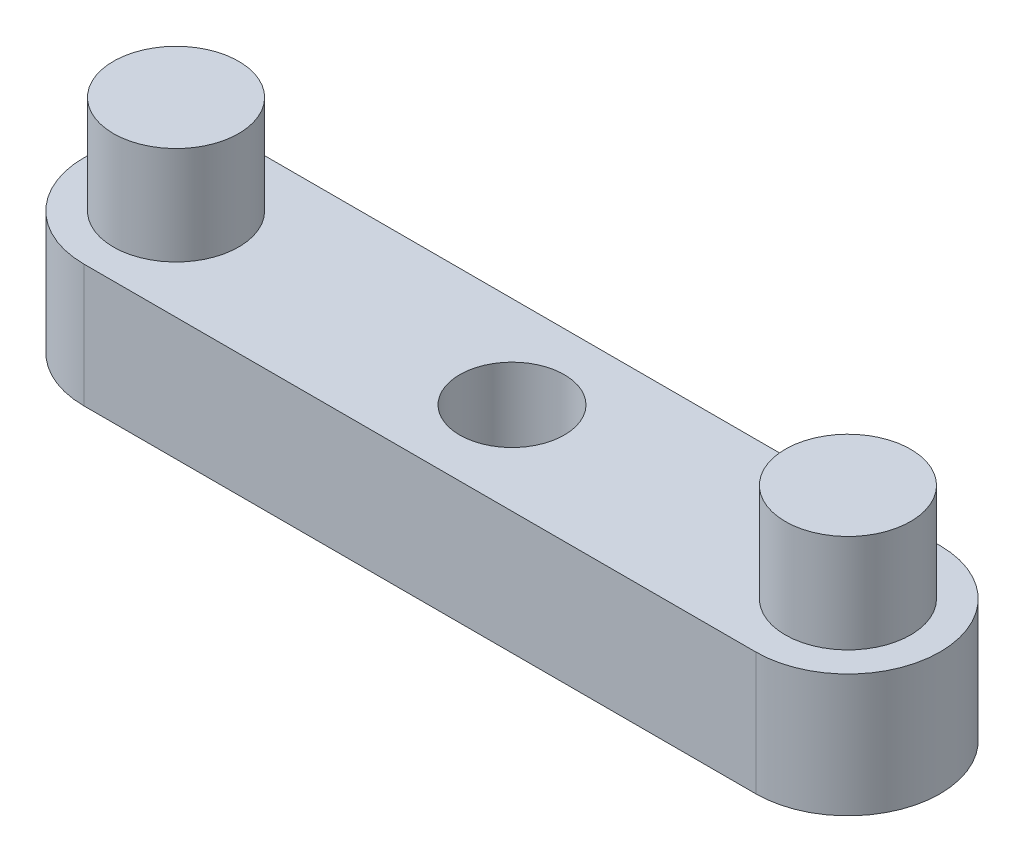
ISO-10303-21;
HEADER;
FILE_DESCRIPTION(('STEP AP214'),'2;1');
FILE_NAME('part.step','',(''),(''),'','','');
FILE_SCHEMA(('AUTOMOTIVE_DESIGN { 1 0 10303 214 1 1 1 1 }'));
ENDSEC;
DATA;
#1=APPLICATION_CONTEXT('core data for automotive mechanical design processes');
#2=APPLICATION_PROTOCOL_DEFINITION('international standard','automotive_design',2000,#1);
#3=PRODUCT_CONTEXT('',#1,'mechanical');
#4=PRODUCT('Part','Part','',(#3));
#5=PRODUCT_RELATED_PRODUCT_CATEGORY('part','',(#4));
#6=PRODUCT_DEFINITION_FORMATION('','',#4);
#7=PRODUCT_DEFINITION_CONTEXT('part definition',#1,'design');
#8=PRODUCT_DEFINITION('design','',#6,#7);
#9=PRODUCT_DEFINITION_SHAPE('','',#8);
#10=(LENGTH_UNIT() NAMED_UNIT(*) SI_UNIT(.MILLI.,.METRE.));
#11=(NAMED_UNIT(*) PLANE_ANGLE_UNIT() SI_UNIT($,.RADIAN.));
#12=(NAMED_UNIT(*) SI_UNIT($,.STERADIAN.) SOLID_ANGLE_UNIT());
#13=UNCERTAINTY_MEASURE_WITH_UNIT(LENGTH_MEASURE(1.E-05),#10,'distance_accuracy_value','');
#14=(GEOMETRIC_REPRESENTATION_CONTEXT(3) GLOBAL_UNCERTAINTY_ASSIGNED_CONTEXT((#13)) GLOBAL_UNIT_ASSIGNED_CONTEXT((#10,
#11,#12)) REPRESENTATION_CONTEXT('',''));
#15=CARTESIAN_POINT('',(0.,0.,0.));
#16=DIRECTION('',(0.,0.,1.));
#17=DIRECTION('',(1.,0.,0.));
#18=AXIS2_PLACEMENT_3D('',#15,#16,#17);
#19=CARTESIAN_POINT('',(-13.675,-2.5,0.));
#20=DIRECTION('',(0.,1.,0.));
#21=DIRECTION('',(0.,0.,1.));
#22=AXIS2_PLACEMENT_3D('',#19,#20,#21);
#23=CYLINDRICAL_SURFACE('',#22,3.75);
#24=DIRECTION('',(0.,1.,0.));
#25=VECTOR('',#24,1.);
#26=CARTESIAN_POINT('',(-13.675,-2.5,3.75));
#27=LINE('',#26,#25);
#28=CARTESIAN_POINT('',(-13.675,-2.5,3.75));
#29=VERTEX_POINT('',#28);
#30=CARTESIAN_POINT('',(-13.675,2.5,3.75));
#31=VERTEX_POINT('',#30);
#32=EDGE_CURVE('E48',#29,#31,#27,.T.);
#33=ORIENTED_EDGE('',*,*,#32,.T.);
#34=CARTESIAN_POINT('',(-13.675,2.5,0.));
#35=DIRECTION('',(0.,1.,0.));
#36=DIRECTION('',(0.,0.,1.));
#37=AXIS2_PLACEMENT_3D('',#34,#35,#36);
#38=CIRCLE('',#37,3.75);
#39=CARTESIAN_POINT('',(-13.675,2.5,-3.75));
#40=VERTEX_POINT('',#39);
#41=EDGE_CURVE('E86',#40,#31,#38,.T.);
#42=ORIENTED_EDGE('',*,*,#41,.F.);
#43=DIRECTION('',(0.,1.,0.));
#44=VECTOR('',#43,1.);
#45=CARTESIAN_POINT('',(-13.675,-2.5,-3.75));
#46=LINE('',#45,#44);
#47=CARTESIAN_POINT('',(-13.675,-2.5,-3.75));
#48=VERTEX_POINT('',#47);
#49=EDGE_CURVE('E11',#48,#40,#46,.T.);
#50=ORIENTED_EDGE('',*,*,#49,.F.);
#51=CARTESIAN_POINT('',(-13.675,-2.5,0.));
#52=DIRECTION('',(0.,1.,0.));
#53=DIRECTION('',(0.,0.,1.));
#54=AXIS2_PLACEMENT_3D('',#51,#52,#53);
#55=CIRCLE('',#54,3.75);
#56=EDGE_CURVE('E87',#48,#29,#55,.T.);
#57=ORIENTED_EDGE('',*,*,#56,.T.);
#58=EDGE_LOOP('',(#33,#42,#50,#57));
#59=FACE_BOUND('',#58,.T.);
#60=ADVANCED_FACE('F45',(#59),#23,.T.);
#61=CARTESIAN_POINT('',(-13.675,-2.5,-3.75));
#62=DIRECTION('',(0.,0.,-1.));
#63=DIRECTION('',(-1.,0.,0.));
#64=AXIS2_PLACEMENT_3D('',#61,#62,#63);
#65=PLANE('',#64);
#66=ORIENTED_EDGE('',*,*,#49,.T.);
#67=DIRECTION('',(-1.,0.,0.));
#68=VECTOR('',#67,1.);
#69=CARTESIAN_POINT('',(-13.675,2.5,-3.75));
#70=LINE('',#69,#68);
#71=CARTESIAN_POINT('',(13.675,2.5,-3.75));
#72=VERTEX_POINT('',#71);
#73=EDGE_CURVE('E106',#72,#40,#70,.T.);
#74=ORIENTED_EDGE('',*,*,#73,.F.);
#75=DIRECTION('',(0.,1.,0.));
#76=VECTOR('',#75,1.);
#77=CARTESIAN_POINT('',(13.675,-2.5,-3.75));
#78=LINE('',#77,#76);
#79=CARTESIAN_POINT('',(13.675,-2.5,-3.75));
#80=VERTEX_POINT('',#79);
#81=EDGE_CURVE('E54',#80,#72,#78,.T.);
#82=ORIENTED_EDGE('',*,*,#81,.F.);
#83=DIRECTION('',(-1.,0.,0.));
#84=VECTOR('',#83,1.);
#85=CARTESIAN_POINT('',(-13.675,-2.5,-3.75));
#86=LINE('',#85,#84);
#87=EDGE_CURVE('E93',#80,#48,#86,.T.);
#88=ORIENTED_EDGE('',*,*,#87,.T.);
#89=EDGE_LOOP('',(#66,#74,#82,#88));
#90=FACE_BOUND('',#89,.T.);
#91=ADVANCED_FACE('F140',(#90),#65,.T.);
#92=CARTESIAN_POINT('',(13.675,-2.5,0.));
#93=DIRECTION('',(0.,1.,0.));
#94=DIRECTION('',(0.,0.,1.));
#95=AXIS2_PLACEMENT_3D('',#92,#93,#94);
#96=CYLINDRICAL_SURFACE('',#95,3.75);
#97=ORIENTED_EDGE('',*,*,#81,.T.);
#98=CARTESIAN_POINT('',(13.675,2.5,0.));
#99=DIRECTION('',(0.,1.,0.));
#100=DIRECTION('',(0.,0.,1.));
#101=AXIS2_PLACEMENT_3D('',#98,#99,#100);
#102=CIRCLE('',#101,3.75);
#103=CARTESIAN_POINT('',(13.675,2.5,3.74999999999999));
#104=VERTEX_POINT('',#103);
#105=EDGE_CURVE('E101',#104,#72,#102,.T.);
#106=ORIENTED_EDGE('',*,*,#105,.F.);
#107=DIRECTION('',(0.,1.,0.));
#108=VECTOR('',#107,1.);
#109=CARTESIAN_POINT('',(13.675,-2.5,3.74999999999999));
#110=LINE('',#109,#108);
#111=CARTESIAN_POINT('',(13.675,-2.5,3.74999999999999));
#112=VERTEX_POINT('',#111);
#113=EDGE_CURVE('E92',#112,#104,#110,.T.);
#114=ORIENTED_EDGE('',*,*,#113,.F.);
#115=CARTESIAN_POINT('',(13.675,-2.5,0.));
#116=DIRECTION('',(0.,1.,0.));
#117=DIRECTION('',(0.,0.,1.));
#118=AXIS2_PLACEMENT_3D('',#115,#116,#117);
#119=CIRCLE('',#118,3.75);
#120=EDGE_CURVE('E129',#112,#80,#119,.T.);
#121=ORIENTED_EDGE('',*,*,#120,.T.);
#122=EDGE_LOOP('',(#97,#106,#114,#121));
#123=FACE_BOUND('',#122,.T.);
#124=ADVANCED_FACE('F137',(#123),#96,.T.);
#125=CARTESIAN_POINT('',(-13.675,-2.5,3.75));
#126=DIRECTION('',(0.,0.,1.));
#127=DIRECTION('',(1.,0.,0.));
#128=AXIS2_PLACEMENT_3D('',#125,#126,#127);
#129=PLANE('',#128);
#130=ORIENTED_EDGE('',*,*,#113,.T.);
#131=DIRECTION('',(1.,0.,0.));
#132=VECTOR('',#131,1.);
#133=CARTESIAN_POINT('',(-13.675,2.5,3.75));
#134=LINE('',#133,#132);
#135=EDGE_CURVE('E95',#31,#104,#134,.T.);
#136=ORIENTED_EDGE('',*,*,#135,.F.);
#137=ORIENTED_EDGE('',*,*,#32,.F.);
#138=DIRECTION('',(1.,0.,0.));
#139=VECTOR('',#138,1.);
#140=CARTESIAN_POINT('',(-13.675,-2.5,3.75));
#141=LINE('',#140,#139);
#142=EDGE_CURVE('E126',#29,#112,#141,.T.);
#143=ORIENTED_EDGE('',*,*,#142,.T.);
#144=EDGE_LOOP('',(#130,#136,#137,#143));
#145=FACE_BOUND('',#144,.T.);
#146=ADVANCED_FACE('F96',(#145),#129,.T.);
#147=CARTESIAN_POINT('',(-13.675,-2.5,0.));
#148=DIRECTION('',(0.,1.,0.));
#149=DIRECTION('',(0.,0.,1.));
#150=AXIS2_PLACEMENT_3D('',#147,#148,#149);
#151=PLANE('',#150);
#152=CARTESIAN_POINT('',(0.,-2.5,0.));
#153=DIRECTION('',(0.,1.,0.));
#154=DIRECTION('',(0.,0.,1.));
#155=AXIS2_PLACEMENT_3D('',#152,#153,#154);
#156=CIRCLE('',#155,2.13);
#157=CARTESIAN_POINT('',(0.,-2.5,2.13));
#158=VERTEX_POINT('',#157);
#159=EDGE_CURVE('E120',#158,#158,#156,.T.);
#160=ORIENTED_EDGE('',*,*,#159,.T.);
#161=EDGE_LOOP('',(#160));
#162=FACE_BOUND('',#161,.T.);
#163=ORIENTED_EDGE('',*,*,#56,.F.);
#164=ORIENTED_EDGE('',*,*,#87,.F.);
#165=ORIENTED_EDGE('',*,*,#120,.F.);
#166=ORIENTED_EDGE('',*,*,#142,.F.);
#167=EDGE_LOOP('',(#163,#164,#165,#166));
#168=FACE_BOUND('',#167,.T.);
#169=ADVANCED_FACE('F142',(#162,#168),#151,.F.);
#170=CARTESIAN_POINT('',(0.,-2.5,0.));
#171=DIRECTION('',(0.,1.,0.));
#172=DIRECTION('',(0.,0.,1.));
#173=AXIS2_PLACEMENT_3D('',#170,#171,#172);
#174=CYLINDRICAL_SURFACE('',#173,2.13);
#175=ORIENTED_EDGE('',*,*,#159,.F.);
#176=EDGE_LOOP('',(#175));
#177=FACE_BOUND('',#176,.T.);
#178=CARTESIAN_POINT('',(0.,2.5,0.));
#179=DIRECTION('',(0.,1.,0.));
#180=DIRECTION('',(0.,0.,1.));
#181=AXIS2_PLACEMENT_3D('',#178,#179,#180);
#182=CIRCLE('',#181,2.13);
#183=CARTESIAN_POINT('',(0.,2.5,2.13));
#184=VERTEX_POINT('',#183);
#185=EDGE_CURVE('E108',#184,#184,#182,.T.);
#186=ORIENTED_EDGE('',*,*,#185,.T.);
#187=EDGE_LOOP('',(#186));
#188=FACE_BOUND('',#187,.T.);
#189=ADVANCED_FACE('F144',(#177,#188),#174,.F.);
#190=CARTESIAN_POINT('',(-13.675,2.5,0.));
#191=DIRECTION('',(0.,1.,0.));
#192=DIRECTION('',(0.,0.,1.));
#193=AXIS2_PLACEMENT_3D('',#190,#191,#192);
#194=PLANE('',#193);
#195=CARTESIAN_POINT('',(13.675,2.5,0.));
#196=DIRECTION('',(0.,1.,0.));
#197=DIRECTION('',(0.,0.,1.));
#198=AXIS2_PLACEMENT_3D('',#195,#196,#197);
#199=CIRCLE('',#198,2.55);
#200=CARTESIAN_POINT('',(13.675,2.5,2.55));
#201=VERTEX_POINT('',#200);
#202=EDGE_CURVE('E289',#201,#201,#199,.T.);
#203=ORIENTED_EDGE('',*,*,#202,.F.);
#204=EDGE_LOOP('',(#203));
#205=FACE_BOUND('',#204,.T.);
#206=CARTESIAN_POINT('',(-13.675,2.5,0.));
#207=DIRECTION('',(0.,1.,0.));
#208=DIRECTION('',(0.,0.,1.));
#209=AXIS2_PLACEMENT_3D('',#206,#207,#208);
#210=CIRCLE('',#209,2.55);
#211=CARTESIAN_POINT('',(-13.675,2.5,2.55));
#212=VERTEX_POINT('',#211);
#213=EDGE_CURVE('E293',#212,#212,#210,.T.);
#214=ORIENTED_EDGE('',*,*,#213,.F.);
#215=EDGE_LOOP('',(#214));
#216=FACE_BOUND('',#215,.T.);
#217=ORIENTED_EDGE('',*,*,#41,.T.);
#218=ORIENTED_EDGE('',*,*,#135,.T.);
#219=ORIENTED_EDGE('',*,*,#105,.T.);
#220=ORIENTED_EDGE('',*,*,#73,.T.);
#221=EDGE_LOOP('',(#217,#218,#219,#220));
#222=FACE_BOUND('',#221,.T.);
#223=ORIENTED_EDGE('',*,*,#185,.F.);
#224=EDGE_LOOP('',(#223));
#225=FACE_BOUND('',#224,.T.);
#226=ADVANCED_FACE('F104',(#205,#216,#222,#225),#194,.T.);
#227=CARTESIAN_POINT('',(-13.675,6.5,0.));
#228=DIRECTION('',(0.,-1.,0.));
#229=DIRECTION('',(0.,0.,-1.));
#230=AXIS2_PLACEMENT_3D('',#227,#228,#229);
#231=CYLINDRICAL_SURFACE('',#230,2.55);
#232=CARTESIAN_POINT('',(-13.675,6.5,0.));
#233=DIRECTION('',(0.,1.,0.));
#234=DIRECTION('',(0.,0.,1.));
#235=AXIS2_PLACEMENT_3D('',#232,#233,#234);
#236=CIRCLE('',#235,2.55);
#237=CARTESIAN_POINT('',(-13.675,6.5,2.55));
#238=VERTEX_POINT('',#237);
#239=EDGE_CURVE('E112',#238,#238,#236,.T.);
#240=ORIENTED_EDGE('',*,*,#239,.F.);
#241=EDGE_LOOP('',(#240));
#242=FACE_BOUND('',#241,.T.);
#243=ORIENTED_EDGE('',*,*,#213,.T.);
#244=EDGE_LOOP('',(#243));
#245=FACE_BOUND('',#244,.T.);
#246=ADVANCED_FACE('F187',(#242,#245),#231,.T.);
#247=CARTESIAN_POINT('',(-13.675,6.5,0.));
#248=DIRECTION('',(0.,1.,0.));
#249=DIRECTION('',(0.,0.,1.));
#250=AXIS2_PLACEMENT_3D('',#247,#248,#249);
#251=PLANE('',#250);
#252=ORIENTED_EDGE('',*,*,#239,.T.);
#253=EDGE_LOOP('',(#252));
#254=FACE_BOUND('',#253,.T.);
#255=ADVANCED_FACE('F197',(#254),#251,.T.);
#256=CARTESIAN_POINT('',(13.675,6.5,0.));
#257=DIRECTION('',(0.,-1.,0.));
#258=DIRECTION('',(0.,0.,-1.));
#259=AXIS2_PLACEMENT_3D('',#256,#257,#258);
#260=CYLINDRICAL_SURFACE('',#259,2.55);
#261=CARTESIAN_POINT('',(13.675,6.5,0.));
#262=DIRECTION('',(0.,1.,0.));
#263=DIRECTION('',(0.,0.,1.));
#264=AXIS2_PLACEMENT_3D('',#261,#262,#263);
#265=CIRCLE('',#264,2.55);
#266=CARTESIAN_POINT('',(13.675,6.5,2.55));
#267=VERTEX_POINT('',#266);
#268=EDGE_CURVE('E287',#267,#267,#265,.T.);
#269=ORIENTED_EDGE('',*,*,#268,.F.);
#270=EDGE_LOOP('',(#269));
#271=FACE_BOUND('',#270,.T.);
#272=ORIENTED_EDGE('',*,*,#202,.T.);
#273=EDGE_LOOP('',(#272));
#274=FACE_BOUND('',#273,.T.);
#275=ADVANCED_FACE('F207',(#271,#274),#260,.T.);
#276=CARTESIAN_POINT('',(13.675,6.5,0.));
#277=DIRECTION('',(0.,1.,0.));
#278=DIRECTION('',(0.,0.,1.));
#279=AXIS2_PLACEMENT_3D('',#276,#277,#278);
#280=PLANE('',#279);
#281=ORIENTED_EDGE('',*,*,#268,.T.);
#282=EDGE_LOOP('',(#281));
#283=FACE_BOUND('',#282,.T.);
#284=ADVANCED_FACE('F217',(#283),#280,.T.);
#285=CLOSED_SHELL('',(#60,#91,#124,#146,#169,#189,#226,#246,#255,#275,#284));
#286=MANIFOLD_SOLID_BREP('B2',#285);
#287=ADVANCED_BREP_SHAPE_REPRESENTATION('',(#18,#286),#14);
#288=SHAPE_DEFINITION_REPRESENTATION(#9,#287);
ENDSEC;
END-ISO-10303-21;
